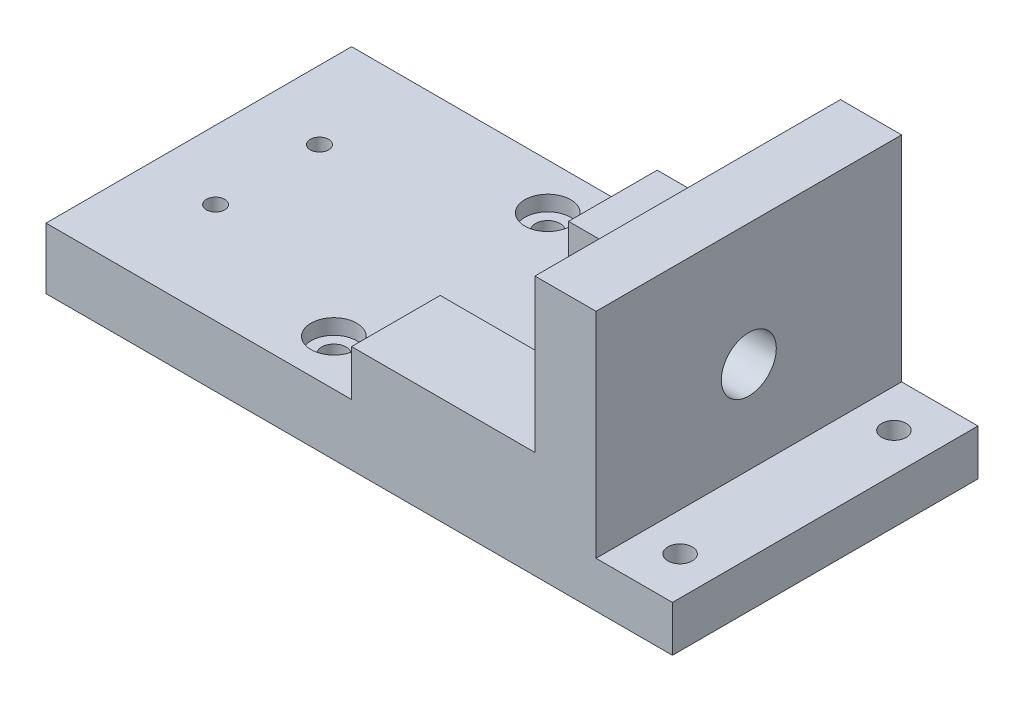
ISO-10303-21;
HEADER;
FILE_DESCRIPTION(('STEP AP214'),'2;1');
FILE_NAME('part.step','',(''),(''),'','','');
FILE_SCHEMA(('AUTOMOTIVE_DESIGN { 1 0 10303 214 1 1 1 1 }'));
ENDSEC;
DATA;
#1=APPLICATION_CONTEXT('core data for automotive mechanical design processes');
#2=APPLICATION_PROTOCOL_DEFINITION('international standard','automotive_design',2000,#1);
#3=PRODUCT_CONTEXT('',#1,'mechanical');
#4=PRODUCT('Part','Part','',(#3));
#5=PRODUCT_RELATED_PRODUCT_CATEGORY('part','',(#4));
#6=PRODUCT_DEFINITION_FORMATION('','',#4);
#7=PRODUCT_DEFINITION_CONTEXT('part definition',#1,'design');
#8=PRODUCT_DEFINITION('design','',#6,#7);
#9=PRODUCT_DEFINITION_SHAPE('','',#8);
#10=(LENGTH_UNIT() NAMED_UNIT(*) SI_UNIT(.MILLI.,.METRE.));
#11=(NAMED_UNIT(*) PLANE_ANGLE_UNIT() SI_UNIT($,.RADIAN.));
#12=(NAMED_UNIT(*) SI_UNIT($,.STERADIAN.) SOLID_ANGLE_UNIT());
#13=UNCERTAINTY_MEASURE_WITH_UNIT(LENGTH_MEASURE(1.E-05),#10,'distance_accuracy_value','');
#14=(GEOMETRIC_REPRESENTATION_CONTEXT(3) GLOBAL_UNCERTAINTY_ASSIGNED_CONTEXT((#13)) GLOBAL_UNIT_ASSIGNED_CONTEXT((#10,
#11,#12)) REPRESENTATION_CONTEXT('',''));
#15=CARTESIAN_POINT('',(0.,0.,0.));
#16=DIRECTION('',(0.,0.,1.));
#17=DIRECTION('',(1.,0.,0.));
#18=AXIS2_PLACEMENT_3D('',#15,#16,#17);
#19=CARTESIAN_POINT('',(-105.,20.,50.));
#20=DIRECTION('',(0.,-1.,0.));
#21=DIRECTION('',(1.,0.,0.));
#22=AXIS2_PLACEMENT_3D('',#19,#20,#21);
#23=PLANE('',#22);
#24=DIRECTION('',(-1.,0.,0.));
#25=VECTOR('',#24,1.);
#26=CARTESIAN_POINT('',(-105.,20.,-50.));
#27=LINE('',#26,#25);
#28=CARTESIAN_POINT('',(-105.,20.,-50.));
#29=VERTEX_POINT('',#28);
#30=CARTESIAN_POINT('',(-205.,20.,-50.));
#31=VERTEX_POINT('',#30);
#32=EDGE_CURVE('E181',#29,#31,#27,.T.);
#33=ORIENTED_EDGE('',*,*,#32,.T.);
#34=DIRECTION('',(0.,0.,-1.));
#35=VECTOR('',#34,1.);
#36=CARTESIAN_POINT('',(-205.,20.,50.));
#37=LINE('',#36,#35);
#38=CARTESIAN_POINT('',(-205.,20.,50.));
#39=VERTEX_POINT('',#38);
#40=EDGE_CURVE('E154',#39,#31,#37,.T.);
#41=ORIENTED_EDGE('',*,*,#40,.F.);
#42=DIRECTION('',(-1.,0.,0.));
#43=VECTOR('',#42,1.);
#44=CARTESIAN_POINT('',(-105.,20.,50.));
#45=LINE('',#44,#43);
#46=CARTESIAN_POINT('',(-105.,20.,50.));
#47=VERTEX_POINT('',#46);
#48=EDGE_CURVE('E135',#47,#39,#45,.T.);
#49=ORIENTED_EDGE('',*,*,#48,.F.);
#50=DIRECTION('',(0.,0.,-1.));
#51=VECTOR('',#50,1.);
#52=CARTESIAN_POINT('',(-105.,20.,50.));
#53=LINE('',#52,#51);
#54=CARTESIAN_POINT('',(-105.,20.,21.));
#55=VERTEX_POINT('',#54);
#56=EDGE_CURVE('E145',#47,#55,#53,.T.);
#57=ORIENTED_EDGE('',*,*,#56,.T.);
#58=DIRECTION('',(1.,0.,0.));
#59=VECTOR('',#58,1.);
#60=CARTESIAN_POINT('',(-105.,20.,21.));
#61=LINE('',#60,#59);
#62=CARTESIAN_POINT('',(-45.,20.,21.));
#63=VERTEX_POINT('',#62);
#64=EDGE_CURVE('E260',#55,#63,#61,.T.);
#65=ORIENTED_EDGE('',*,*,#64,.T.);
#66=DIRECTION('',(0.,0.,-1.));
#67=VECTOR('',#66,1.);
#68=CARTESIAN_POINT('',(-45.,20.,-21.));
#69=LINE('',#68,#67);
#70=CARTESIAN_POINT('',(-45.,20.,-21.));
#71=VERTEX_POINT('',#70);
#72=EDGE_CURVE('E268',#63,#71,#69,.T.);
#73=ORIENTED_EDGE('',*,*,#72,.T.);
#74=DIRECTION('',(-1.,0.,0.));
#75=VECTOR('',#74,1.);
#76=CARTESIAN_POINT('',(-105.,20.,-21.));
#77=LINE('',#76,#75);
#78=CARTESIAN_POINT('',(-105.,20.,-21.));
#79=VERTEX_POINT('',#78);
#80=EDGE_CURVE('E54',#71,#79,#77,.T.);
#81=ORIENTED_EDGE('',*,*,#80,.T.);
#82=EDGE_CURVE('E151',#79,#29,#53,.T.);
#83=ORIENTED_EDGE('',*,*,#82,.T.);
#84=EDGE_LOOP('',(#33,#41,#49,#57,#65,#73,#81,#83));
#85=FACE_BOUND('',#84,.T.);
#86=CARTESIAN_POINT('',(-182.5,20.,17.));
#87=DIRECTION('',(0.,-1.,0.));
#88=DIRECTION('',(1.,0.,0.));
#89=AXIS2_PLACEMENT_3D('',#86,#87,#88);
#90=CIRCLE('',#89,2.99999999999999);
#91=CARTESIAN_POINT('',(-179.5,20.,17.));
#92=VERTEX_POINT('',#91);
#93=EDGE_CURVE('E235',#92,#92,#90,.T.);
#94=ORIENTED_EDGE('',*,*,#93,.T.);
#95=EDGE_LOOP('',(#94));
#96=FACE_BOUND('',#95,.T.);
#97=CARTESIAN_POINT('',(-182.5,20.,-17.));
#98=DIRECTION('',(0.,1.,0.));
#99=DIRECTION('',(-1.,0.,0.));
#100=AXIS2_PLACEMENT_3D('',#97,#98,#99);
#101=CIRCLE('',#100,2.99999999999999);
#102=CARTESIAN_POINT('',(-185.5,20.,-17.));
#103=VERTEX_POINT('',#102);
#104=EDGE_CURVE('E244',#103,#103,#101,.T.);
#105=ORIENTED_EDGE('',*,*,#104,.F.);
#106=EDGE_LOOP('',(#105));
#107=FACE_BOUND('',#106,.T.);
#108=CARTESIAN_POINT('',(-125.788008322754,20.,35.));
#109=DIRECTION('',(0.,-1.,0.));
#110=DIRECTION('',(1.,0.,0.));
#111=AXIS2_PLACEMENT_3D('',#108,#109,#110);
#112=CIRCLE('',#111,7.49999999999996);
#113=CARTESIAN_POINT('',(-118.288008322754,20.,35.));
#114=VERTEX_POINT('',#113);
#115=EDGE_CURVE('E227',#114,#114,#112,.T.);
#116=ORIENTED_EDGE('',*,*,#115,.T.);
#117=EDGE_LOOP('',(#116));
#118=FACE_BOUND('',#117,.T.);
#119=CARTESIAN_POINT('',(-125.788008322754,20.,-35.));
#120=DIRECTION('',(0.,1.,0.));
#121=DIRECTION('',(-1.,0.,0.));
#122=AXIS2_PLACEMENT_3D('',#119,#120,#121);
#123=CIRCLE('',#122,7.50000000000001);
#124=CARTESIAN_POINT('',(-133.288008322754,20.,-35.));
#125=VERTEX_POINT('',#124);
#126=EDGE_CURVE('E222',#125,#125,#123,.T.);
#127=ORIENTED_EDGE('',*,*,#126,.F.);
#128=EDGE_LOOP('',(#127));
#129=FACE_BOUND('',#128,.T.);
#130=ADVANCED_FACE('F37',(#85,#96,#107,#118,#129),#23,.F.);
#131=CARTESIAN_POINT('',(-125.788008322754,0.,-35.));
#132=DIRECTION('',(0.,1.,0.));
#133=DIRECTION('',(-1.,0.,0.));
#134=AXIS2_PLACEMENT_3D('',#131,#132,#133);
#135=CYLINDRICAL_SURFACE('',#134,3.99999999999999);
#136=CARTESIAN_POINT('',(-125.788008322754,0.,-35.));
#137=DIRECTION('',(0.,1.,0.));
#138=DIRECTION('',(-1.,0.,0.));
#139=AXIS2_PLACEMENT_3D('',#136,#137,#138);
#140=CIRCLE('',#139,3.99999999999999);
#141=CARTESIAN_POINT('',(-129.788008322754,0.,-35.));
#142=VERTEX_POINT('',#141);
#143=EDGE_CURVE('E241',#142,#142,#140,.T.);
#144=ORIENTED_EDGE('',*,*,#143,.F.);
#145=EDGE_LOOP('',(#144));
#146=FACE_BOUND('',#145,.T.);
#147=CARTESIAN_POINT('',(-125.788008322754,15.,-35.));
#148=DIRECTION('',(0.,1.,0.));
#149=DIRECTION('',(-1.,0.,0.));
#150=AXIS2_PLACEMENT_3D('',#147,#148,#149);
#151=CIRCLE('',#150,3.99999999999999);
#152=CARTESIAN_POINT('',(-129.788008322754,15.,-35.));
#153=VERTEX_POINT('',#152);
#154=EDGE_CURVE('E214',#153,#153,#151,.F.);
#155=ORIENTED_EDGE('',*,*,#154,.F.);
#156=EDGE_LOOP('',(#155));
#157=FACE_BOUND('',#156,.T.);
#158=ADVANCED_FACE('F360',(#146,#157),#135,.F.);
#159=CARTESIAN_POINT('',(-205.,0.,50.));
#160=DIRECTION('',(0.,1.,0.));
#161=DIRECTION('',(0.,0.,1.));
#162=AXIS2_PLACEMENT_3D('',#159,#160,#161);
#163=PLANE('',#162);
#164=ORIENTED_EDGE('',*,*,#143,.T.);
#165=EDGE_LOOP('',(#164));
#166=FACE_BOUND('',#165,.T.);
#167=CARTESIAN_POINT('',(-182.5,0.,-17.));
#168=DIRECTION('',(0.,1.,0.));
#169=DIRECTION('',(-1.,0.,0.));
#170=AXIS2_PLACEMENT_3D('',#167,#168,#169);
#171=CIRCLE('',#170,2.99999999999999);
#172=CARTESIAN_POINT('',(-185.5,0.,-17.));
#173=VERTEX_POINT('',#172);
#174=EDGE_CURVE('E247',#173,#173,#171,.T.);
#175=ORIENTED_EDGE('',*,*,#174,.T.);
#176=EDGE_LOOP('',(#175));
#177=FACE_BOUND('',#176,.T.);
#178=CARTESIAN_POINT('',(-12.5,0.,-35.));
#179=DIRECTION('',(0.,1.,0.));
#180=DIRECTION('',(-1.,0.,0.));
#181=AXIS2_PLACEMENT_3D('',#178,#179,#180);
#182=CIRCLE('',#181,4.);
#183=CARTESIAN_POINT('',(-16.5,0.,-35.));
#184=VERTEX_POINT('',#183);
#185=EDGE_CURVE('E211',#184,#184,#182,.T.);
#186=ORIENTED_EDGE('',*,*,#185,.T.);
#187=EDGE_LOOP('',(#186));
#188=FACE_BOUND('',#187,.T.);
#189=DIRECTION('',(1.,0.,0.));
#190=VECTOR('',#189,1.);
#191=CARTESIAN_POINT('',(-205.,0.,-50.));
#192=LINE('',#191,#190);
#193=CARTESIAN_POINT('',(-205.,0.,-50.));
#194=VERTEX_POINT('',#193);
#195=CARTESIAN_POINT('',(0.,0.,-50.));
#196=VERTEX_POINT('',#195);
#197=EDGE_CURVE('E160',#194,#196,#192,.T.);
#198=ORIENTED_EDGE('',*,*,#197,.T.);
#199=DIRECTION('',(0.,0.,-1.));
#200=VECTOR('',#199,1.);
#201=CARTESIAN_POINT('',(0.,0.,50.));
#202=LINE('',#201,#200);
#203=CARTESIAN_POINT('',(0.,0.,50.));
#204=VERTEX_POINT('',#203);
#205=EDGE_CURVE('E11',#204,#196,#202,.T.);
#206=ORIENTED_EDGE('',*,*,#205,.F.);
#207=DIRECTION('',(1.,0.,0.));
#208=VECTOR('',#207,1.);
#209=CARTESIAN_POINT('',(-205.,0.,50.));
#210=LINE('',#209,#208);
#211=CARTESIAN_POINT('',(-205.,0.,50.));
#212=VERTEX_POINT('',#211);
#213=EDGE_CURVE('E184',#212,#204,#210,.T.);
#214=ORIENTED_EDGE('',*,*,#213,.F.);
#215=DIRECTION('',(0.,0.,-1.));
#216=VECTOR('',#215,1.);
#217=CARTESIAN_POINT('',(-205.,0.,50.));
#218=LINE('',#217,#216);
#219=EDGE_CURVE('E156',#212,#194,#218,.T.);
#220=ORIENTED_EDGE('',*,*,#219,.T.);
#221=EDGE_LOOP('',(#198,#206,#214,#220));
#222=FACE_BOUND('',#221,.T.);
#223=CARTESIAN_POINT('',(-182.5,0.,17.));
#224=DIRECTION('',(0.,-1.,0.));
#225=DIRECTION('',(1.,0.,0.));
#226=AXIS2_PLACEMENT_3D('',#223,#224,#225);
#227=CIRCLE('',#226,2.99999999999999);
#228=CARTESIAN_POINT('',(-179.5,0.,17.));
#229=VERTEX_POINT('',#228);
#230=EDGE_CURVE('E220',#229,#229,#227,.T.);
#231=ORIENTED_EDGE('',*,*,#230,.F.);
#232=EDGE_LOOP('',(#231));
#233=FACE_BOUND('',#232,.T.);
#234=CARTESIAN_POINT('',(-125.788008322754,0.,35.));
#235=DIRECTION('',(0.,-1.,0.));
#236=DIRECTION('',(1.,0.,0.));
#237=AXIS2_PLACEMENT_3D('',#234,#235,#236);
#238=CIRCLE('',#237,3.99999999999994);
#239=CARTESIAN_POINT('',(-121.788008322754,0.,35.));
#240=VERTEX_POINT('',#239);
#241=EDGE_CURVE('E238',#240,#240,#238,.T.);
#242=ORIENTED_EDGE('',*,*,#241,.F.);
#243=EDGE_LOOP('',(#242));
#244=FACE_BOUND('',#243,.T.);
#245=CARTESIAN_POINT('',(-12.5,0.,35.));
#246=DIRECTION('',(0.,-1.,0.));
#247=DIRECTION('',(1.,0.,0.));
#248=AXIS2_PLACEMENT_3D('',#245,#246,#247);
#249=CIRCLE('',#248,4.);
#250=CARTESIAN_POINT('',(-8.49999999999999,0.,35.));
#251=VERTEX_POINT('',#250);
#252=EDGE_CURVE('E250',#251,#251,#249,.T.);
#253=ORIENTED_EDGE('',*,*,#252,.F.);
#254=EDGE_LOOP('',(#253));
#255=FACE_BOUND('',#254,.T.);
#256=ADVANCED_FACE('F39',(#166,#177,#188,#222,#233,#244,#255),#163,.F.);
#257=CARTESIAN_POINT('',(0.,15.,50.));
#258=DIRECTION('',(0.,-1.,0.));
#259=DIRECTION('',(1.,0.,0.));
#260=AXIS2_PLACEMENT_3D('',#257,#258,#259);
#261=PLANE('',#260);
#262=CARTESIAN_POINT('',(-12.5,15.,-35.));
#263=DIRECTION('',(0.,-1.,0.));
#264=DIRECTION('',(1.,0.,0.));
#265=AXIS2_PLACEMENT_3D('',#262,#263,#264);
#266=CIRCLE('',#265,4.);
#267=CARTESIAN_POINT('',(-8.5,15.,-35.));
#268=VERTEX_POINT('',#267);
#269=EDGE_CURVE('E207',#268,#268,#266,.T.);
#270=ORIENTED_EDGE('',*,*,#269,.T.);
#271=EDGE_LOOP('',(#270));
#272=FACE_BOUND('',#271,.T.);
#273=DIRECTION('',(-1.,0.,0.));
#274=VECTOR('',#273,1.);
#275=CARTESIAN_POINT('',(0.,15.,-50.));
#276=LINE('',#275,#274);
#277=CARTESIAN_POINT('',(0.,15.,-50.));
#278=VERTEX_POINT('',#277);
#279=CARTESIAN_POINT('',(-25.,15.,-50.));
#280=VERTEX_POINT('',#279);
#281=EDGE_CURVE('E166',#278,#280,#276,.T.);
#282=ORIENTED_EDGE('',*,*,#281,.T.);
#283=DIRECTION('',(0.,0.,-1.));
#284=VECTOR('',#283,1.);
#285=CARTESIAN_POINT('',(-25.,15.,50.));
#286=LINE('',#285,#284);
#287=CARTESIAN_POINT('',(-25.,15.,50.));
#288=VERTEX_POINT('',#287);
#289=EDGE_CURVE('E199',#288,#280,#286,.T.);
#290=ORIENTED_EDGE('',*,*,#289,.F.);
#291=DIRECTION('',(-1.,0.,0.));
#292=VECTOR('',#291,1.);
#293=CARTESIAN_POINT('',(0.,15.,50.));
#294=LINE('',#293,#292);
#295=CARTESIAN_POINT('',(0.,15.,50.));
#296=VERTEX_POINT('',#295);
#297=EDGE_CURVE('E281',#296,#288,#294,.T.);
#298=ORIENTED_EDGE('',*,*,#297,.F.);
#299=DIRECTION('',(0.,0.,-1.));
#300=VECTOR('',#299,1.);
#301=CARTESIAN_POINT('',(0.,15.,50.));
#302=LINE('',#301,#300);
#303=EDGE_CURVE('E46',#296,#278,#302,.T.);
#304=ORIENTED_EDGE('',*,*,#303,.T.);
#305=EDGE_LOOP('',(#282,#290,#298,#304));
#306=FACE_BOUND('',#305,.T.);
#307=CARTESIAN_POINT('',(-12.5,15.,35.));
#308=DIRECTION('',(0.,-1.,0.));
#309=DIRECTION('',(1.,0.,0.));
#310=AXIS2_PLACEMENT_3D('',#307,#308,#309);
#311=CIRCLE('',#310,4.);
#312=CARTESIAN_POINT('',(-8.49999999999999,15.,35.));
#313=VERTEX_POINT('',#312);
#314=EDGE_CURVE('E210',#313,#313,#311,.F.);
#315=ORIENTED_EDGE('',*,*,#314,.F.);
#316=EDGE_LOOP('',(#315));
#317=FACE_BOUND('',#316,.T.);
#318=ADVANCED_FACE('F340',(#272,#306,#317),#261,.F.);
#319=CARTESIAN_POINT('',(-45.,35.,50.));
#320=DIRECTION('',(0.,-1.,0.));
#321=DIRECTION('',(0.,0.,-1.));
#322=AXIS2_PLACEMENT_3D('',#319,#320,#321);
#323=PLANE('',#322);
#324=DIRECTION('',(0.,0.,-1.));
#325=VECTOR('',#324,1.);
#326=CARTESIAN_POINT('',(-45.,35.,50.));
#327=LINE('',#326,#325);
#328=CARTESIAN_POINT('',(-45.,35.,50.));
#329=VERTEX_POINT('',#328);
#330=CARTESIAN_POINT('',(-45.,35.,21.));
#331=VERTEX_POINT('',#330);
#332=EDGE_CURVE('E190',#329,#331,#327,.T.);
#333=ORIENTED_EDGE('',*,*,#332,.T.);
#334=DIRECTION('',(1.,0.,0.));
#335=VECTOR('',#334,1.);
#336=CARTESIAN_POINT('',(-105.,35.,21.));
#337=LINE('',#336,#335);
#338=CARTESIAN_POINT('',(-105.,35.,21.));
#339=VERTEX_POINT('',#338);
#340=EDGE_CURVE('E213',#339,#331,#337,.T.);
#341=ORIENTED_EDGE('',*,*,#340,.F.);
#342=DIRECTION('',(0.,0.,-1.));
#343=VECTOR('',#342,1.);
#344=CARTESIAN_POINT('',(-105.,35.,50.));
#345=LINE('',#344,#343);
#346=CARTESIAN_POINT('',(-105.,35.,50.));
#347=VERTEX_POINT('',#346);
#348=EDGE_CURVE('E187',#347,#339,#345,.T.);
#349=ORIENTED_EDGE('',*,*,#348,.F.);
#350=DIRECTION('',(-1.,0.,0.));
#351=VECTOR('',#350,1.);
#352=CARTESIAN_POINT('',(-45.,35.,50.));
#353=LINE('',#352,#351);
#354=EDGE_CURVE('E138',#329,#347,#353,.T.);
#355=ORIENTED_EDGE('',*,*,#354,.F.);
#356=EDGE_LOOP('',(#333,#341,#349,#355));
#357=FACE_BOUND('',#356,.T.);
#358=ADVANCED_FACE('F299',(#357),#323,.F.);
#359=CARTESIAN_POINT('',(-105.,35.,50.));
#360=DIRECTION('',(1.,0.,0.));
#361=DIRECTION('',(0.,0.,-1.));
#362=AXIS2_PLACEMENT_3D('',#359,#360,#361);
#363=PLANE('',#362);
#364=ORIENTED_EDGE('',*,*,#348,.T.);
#365=DIRECTION('',(0.,1.,0.));
#366=VECTOR('',#365,1.);
#367=CARTESIAN_POINT('',(-105.,-53.2393336944022,21.));
#368=LINE('',#367,#366);
#369=EDGE_CURVE('E148',#55,#339,#368,.T.);
#370=ORIENTED_EDGE('',*,*,#369,.F.);
#371=ORIENTED_EDGE('',*,*,#56,.F.);
#372=DIRECTION('',(0.,-1.,0.));
#373=VECTOR('',#372,1.);
#374=CARTESIAN_POINT('',(-105.,35.,50.));
#375=LINE('',#374,#373);
#376=EDGE_CURVE('E131',#347,#47,#375,.T.);
#377=ORIENTED_EDGE('',*,*,#376,.F.);
#378=EDGE_LOOP('',(#364,#370,#371,#377));
#379=FACE_BOUND('',#378,.T.);
#380=ADVANCED_FACE('F146',(#379),#363,.F.);
#381=CARTESIAN_POINT('',(0.,0.,50.));
#382=DIRECTION('',(-1.,0.,0.));
#383=DIRECTION('',(0.,0.,1.));
#384=AXIS2_PLACEMENT_3D('',#381,#382,#383);
#385=PLANE('',#384);
#386=DIRECTION('',(0.,1.,0.));
#387=VECTOR('',#386,1.);
#388=CARTESIAN_POINT('',(0.,0.,-50.));
#389=LINE('',#388,#387);
#390=EDGE_CURVE('E163',#196,#278,#389,.T.);
#391=ORIENTED_EDGE('',*,*,#390,.T.);
#392=ORIENTED_EDGE('',*,*,#303,.F.);
#393=DIRECTION('',(0.,1.,0.));
#394=VECTOR('',#393,1.);
#395=CARTESIAN_POINT('',(0.,0.,50.));
#396=LINE('',#395,#394);
#397=EDGE_CURVE('E109',#204,#296,#396,.T.);
#398=ORIENTED_EDGE('',*,*,#397,.F.);
#399=ORIENTED_EDGE('',*,*,#205,.T.);
#400=EDGE_LOOP('',(#391,#392,#398,#399));
#401=FACE_BOUND('',#400,.T.);
#402=ADVANCED_FACE('F338',(#401),#385,.F.);
#403=CARTESIAN_POINT('',(-25.,15.,50.));
#404=DIRECTION('',(-1.,0.,0.));
#405=DIRECTION('',(0.,0.,1.));
#406=AXIS2_PLACEMENT_3D('',#403,#404,#405);
#407=PLANE('',#406);
#408=CARTESIAN_POINT('',(-25.,45.,0.));
#409=DIRECTION('',(1.,0.,0.));
#410=DIRECTION('',(0.,0.,-1.));
#411=AXIS2_PLACEMENT_3D('',#408,#409,#410);
#412=CIRCLE('',#411,9.);
#413=CARTESIAN_POINT('',(-25.,45.,-9.));
#414=VERTEX_POINT('',#413);
#415=EDGE_CURVE('E206',#414,#414,#412,.T.);
#416=ORIENTED_EDGE('',*,*,#415,.F.);
#417=EDGE_LOOP('',(#416));
#418=FACE_BOUND('',#417,.T.);
#419=DIRECTION('',(0.,1.,0.));
#420=VECTOR('',#419,1.);
#421=CARTESIAN_POINT('',(-25.,15.,-50.));
#422=LINE('',#421,#420);
#423=CARTESIAN_POINT('',(-25.,85.,-50.));
#424=VERTEX_POINT('',#423);
#425=EDGE_CURVE('E168',#280,#424,#422,.T.);
#426=ORIENTED_EDGE('',*,*,#425,.T.);
#427=DIRECTION('',(0.,0.,-1.));
#428=VECTOR('',#427,1.);
#429=CARTESIAN_POINT('',(-25.,85.,50.));
#430=LINE('',#429,#428);
#431=CARTESIAN_POINT('',(-25.,85.,50.));
#432=VERTEX_POINT('',#431);
#433=EDGE_CURVE('E196',#432,#424,#430,.T.);
#434=ORIENTED_EDGE('',*,*,#433,.F.);
#435=DIRECTION('',(0.,1.,0.));
#436=VECTOR('',#435,1.);
#437=CARTESIAN_POINT('',(-25.,15.,50.));
#438=LINE('',#437,#436);
#439=EDGE_CURVE('E283',#288,#432,#438,.T.);
#440=ORIENTED_EDGE('',*,*,#439,.F.);
#441=ORIENTED_EDGE('',*,*,#289,.T.);
#442=EDGE_LOOP('',(#426,#434,#440,#441));
#443=FACE_BOUND('',#442,.T.);
#444=ADVANCED_FACE('F346',(#418,#443),#407,.F.);
#445=CARTESIAN_POINT('',(-25.,85.,50.));
#446=DIRECTION('',(0.,-1.,0.));
#447=DIRECTION('',(1.,0.,0.));
#448=AXIS2_PLACEMENT_3D('',#445,#446,#447);
#449=PLANE('',#448);
#450=DIRECTION('',(-1.,0.,0.));
#451=VECTOR('',#450,1.);
#452=CARTESIAN_POINT('',(-25.,85.,-50.));
#453=LINE('',#452,#451);
#454=CARTESIAN_POINT('',(-45.,85.,-50.));
#455=VERTEX_POINT('',#454);
#456=EDGE_CURVE('E170',#424,#455,#453,.T.);
#457=ORIENTED_EDGE('',*,*,#456,.T.);
#458=DIRECTION('',(0.,0.,-1.));
#459=VECTOR('',#458,1.);
#460=CARTESIAN_POINT('',(-45.,85.,50.));
#461=LINE('',#460,#459);
#462=CARTESIAN_POINT('',(-45.,85.,50.));
#463=VERTEX_POINT('',#462);
#464=EDGE_CURVE('E193',#463,#455,#461,.T.);
#465=ORIENTED_EDGE('',*,*,#464,.F.);
#466=DIRECTION('',(-1.,0.,0.));
#467=VECTOR('',#466,1.);
#468=CARTESIAN_POINT('',(-25.,85.,50.));
#469=LINE('',#468,#467);
#470=EDGE_CURVE('E285',#432,#463,#469,.T.);
#471=ORIENTED_EDGE('',*,*,#470,.F.);
#472=ORIENTED_EDGE('',*,*,#433,.T.);
#473=EDGE_LOOP('',(#457,#465,#471,#472));
#474=FACE_BOUND('',#473,.T.);
#475=ADVANCED_FACE('F348',(#474),#449,.F.);
#476=CARTESIAN_POINT('',(-45.,85.,50.));
#477=DIRECTION('',(1.,0.,0.));
#478=DIRECTION('',(0.,1.,0.));
#479=AXIS2_PLACEMENT_3D('',#476,#477,#478);
#480=PLANE('',#479);
#481=CARTESIAN_POINT('',(-45.,45.,0.));
#482=DIRECTION('',(1.,0.,0.));
#483=DIRECTION('',(0.,1.,0.));
#484=AXIS2_PLACEMENT_3D('',#481,#482,#483);
#485=CIRCLE('',#484,9.);
#486=CARTESIAN_POINT('',(-45.,45.,-9.));
#487=VERTEX_POINT('',#486);
#488=EDGE_CURVE('E164',#487,#487,#485,.T.);
#489=ORIENTED_EDGE('',*,*,#488,.T.);
#490=EDGE_LOOP('',(#489));
#491=FACE_BOUND('',#490,.T.);
#492=DIRECTION('',(0.,-1.,0.));
#493=VECTOR('',#492,1.);
#494=CARTESIAN_POINT('',(-45.,85.,-50.));
#495=LINE('',#494,#493);
#496=CARTESIAN_POINT('',(-45.,35.,-50.));
#497=VERTEX_POINT('',#496);
#498=EDGE_CURVE('E172',#455,#497,#495,.T.);
#499=ORIENTED_EDGE('',*,*,#498,.T.);
#500=CARTESIAN_POINT('',(-45.,35.,-21.));
#501=VERTEX_POINT('',#500);
#502=EDGE_CURVE('E189',#501,#497,#327,.T.);
#503=ORIENTED_EDGE('',*,*,#502,.F.);
#504=DIRECTION('',(0.,1.,0.));
#505=VECTOR('',#504,1.);
#506=CARTESIAN_POINT('',(-45.,-53.2393336944022,-21.));
#507=LINE('',#506,#505);
#508=EDGE_CURVE('E267',#71,#501,#507,.T.);
#509=ORIENTED_EDGE('',*,*,#508,.F.);
#510=ORIENTED_EDGE('',*,*,#72,.F.);
#511=DIRECTION('',(0.,1.,0.));
#512=VECTOR('',#511,1.);
#513=CARTESIAN_POINT('',(-45.,-53.2393336944022,21.));
#514=LINE('',#513,#512);
#515=EDGE_CURVE('E264',#63,#331,#514,.T.);
#516=ORIENTED_EDGE('',*,*,#515,.T.);
#517=ORIENTED_EDGE('',*,*,#332,.F.);
#518=DIRECTION('',(0.,-1.,0.));
#519=VECTOR('',#518,1.);
#520=CARTESIAN_POINT('',(-45.,85.,50.));
#521=LINE('',#520,#519);
#522=EDGE_CURVE('E287',#463,#329,#521,.T.);
#523=ORIENTED_EDGE('',*,*,#522,.F.);
#524=ORIENTED_EDGE('',*,*,#464,.T.);
#525=EDGE_LOOP('',(#499,#503,#509,#510,#516,#517,#523,#524));
#526=FACE_BOUND('',#525,.T.);
#527=ADVANCED_FACE('F293',(#491,#526),#480,.F.);
#528=CARTESIAN_POINT('',(-105.,35.,-21.));
#529=VERTEX_POINT('',#528);
#530=CARTESIAN_POINT('',(-105.,35.,-50.));
#531=VERTEX_POINT('',#530);
#532=EDGE_CURVE('E150',#529,#531,#345,.T.);
#533=ORIENTED_EDGE('',*,*,#532,.F.);
#534=DIRECTION('',(-1.,0.,0.));
#535=VECTOR('',#534,1.);
#536=CARTESIAN_POINT('',(-105.,35.,-21.));
#537=LINE('',#536,#535);
#538=EDGE_CURVE('E257',#501,#529,#537,.T.);
#539=ORIENTED_EDGE('',*,*,#538,.F.);
#540=ORIENTED_EDGE('',*,*,#502,.T.);
#541=DIRECTION('',(-1.,0.,0.));
#542=VECTOR('',#541,1.);
#543=CARTESIAN_POINT('',(-45.,35.,-50.));
#544=LINE('',#543,#542);
#545=EDGE_CURVE('E175',#497,#531,#544,.T.);
#546=ORIENTED_EDGE('',*,*,#545,.T.);
#547=EDGE_LOOP('',(#533,#539,#540,#546));
#548=FACE_BOUND('',#547,.T.);
#549=ADVANCED_FACE('F318',(#548),#323,.F.);
#550=ORIENTED_EDGE('',*,*,#82,.F.);
#551=DIRECTION('',(0.,1.,0.));
#552=VECTOR('',#551,1.);
#553=CARTESIAN_POINT('',(-105.,-53.2393336944022,-21.));
#554=LINE('',#553,#552);
#555=EDGE_CURVE('E266',#79,#529,#554,.T.);
#556=ORIENTED_EDGE('',*,*,#555,.T.);
#557=ORIENTED_EDGE('',*,*,#532,.T.);
#558=DIRECTION('',(0.,-1.,0.));
#559=VECTOR('',#558,1.);
#560=CARTESIAN_POINT('',(-105.,35.,-50.));
#561=LINE('',#560,#559);
#562=EDGE_CURVE('E178',#531,#29,#561,.T.);
#563=ORIENTED_EDGE('',*,*,#562,.T.);
#564=EDGE_LOOP('',(#550,#556,#557,#563));
#565=FACE_BOUND('',#564,.T.);
#566=ADVANCED_FACE('F329',(#565),#363,.F.);
#567=CARTESIAN_POINT('',(-205.,20.,50.));
#568=DIRECTION('',(1.,0.,0.));
#569=DIRECTION('',(0.,0.,-1.));
#570=AXIS2_PLACEMENT_3D('',#567,#568,#569);
#571=PLANE('',#570);
#572=DIRECTION('',(0.,-1.,0.));
#573=VECTOR('',#572,1.);
#574=CARTESIAN_POINT('',(-205.,20.,-50.));
#575=LINE('',#574,#573);
#576=EDGE_CURVE('E101',#31,#194,#575,.T.);
#577=ORIENTED_EDGE('',*,*,#576,.T.);
#578=ORIENTED_EDGE('',*,*,#219,.F.);
#579=DIRECTION('',(0.,-1.,0.));
#580=VECTOR('',#579,1.);
#581=CARTESIAN_POINT('',(-205.,20.,50.));
#582=LINE('',#581,#580);
#583=EDGE_CURVE('E63',#39,#212,#582,.T.);
#584=ORIENTED_EDGE('',*,*,#583,.F.);
#585=ORIENTED_EDGE('',*,*,#40,.T.);
#586=EDGE_LOOP('',(#577,#578,#584,#585));
#587=FACE_BOUND('',#586,.T.);
#588=ADVANCED_FACE('F330',(#587),#571,.F.);
#589=CARTESIAN_POINT('',(0.,0.,50.));
#590=DIRECTION('',(0.,0.,1.));
#591=DIRECTION('',(1.,0.,0.));
#592=AXIS2_PLACEMENT_3D('',#589,#590,#591);
#593=PLANE('',#592);
#594=ORIENTED_EDGE('',*,*,#213,.T.);
#595=ORIENTED_EDGE('',*,*,#397,.T.);
#596=ORIENTED_EDGE('',*,*,#297,.T.);
#597=ORIENTED_EDGE('',*,*,#439,.T.);
#598=ORIENTED_EDGE('',*,*,#470,.T.);
#599=ORIENTED_EDGE('',*,*,#522,.T.);
#600=ORIENTED_EDGE('',*,*,#354,.T.);
#601=ORIENTED_EDGE('',*,*,#376,.T.);
#602=ORIENTED_EDGE('',*,*,#48,.T.);
#603=ORIENTED_EDGE('',*,*,#583,.T.);
#604=EDGE_LOOP('',(#594,#595,#596,#597,#598,#599,#600,#601,#602,#603));
#605=FACE_BOUND('',#604,.T.);
#606=ADVANCED_FACE('F133',(#605),#593,.T.);
#607=CARTESIAN_POINT('',(0.,0.,-50.));
#608=DIRECTION('',(0.,0.,1.));
#609=DIRECTION('',(1.,0.,0.));
#610=AXIS2_PLACEMENT_3D('',#607,#608,#609);
#611=PLANE('',#610);
#612=ORIENTED_EDGE('',*,*,#197,.F.);
#613=ORIENTED_EDGE('',*,*,#576,.F.);
#614=ORIENTED_EDGE('',*,*,#32,.F.);
#615=ORIENTED_EDGE('',*,*,#562,.F.);
#616=ORIENTED_EDGE('',*,*,#545,.F.);
#617=ORIENTED_EDGE('',*,*,#498,.F.);
#618=ORIENTED_EDGE('',*,*,#456,.F.);
#619=ORIENTED_EDGE('',*,*,#425,.F.);
#620=ORIENTED_EDGE('',*,*,#281,.F.);
#621=ORIENTED_EDGE('',*,*,#390,.F.);
#622=EDGE_LOOP('',(#612,#613,#614,#615,#616,#617,#618,#619,#620,#621));
#623=FACE_BOUND('',#622,.T.);
#624=ADVANCED_FACE('F325',(#623),#611,.F.);
#625=CARTESIAN_POINT('',(-205.,45.,0.));
#626=DIRECTION('',(1.,0.,0.));
#627=DIRECTION('',(0.,0.,-1.));
#628=AXIS2_PLACEMENT_3D('',#625,#626,#627);
#629=CYLINDRICAL_SURFACE('',#628,9.);
#630=CARTESIAN_POINT('',(-25.,45.,-9.));
#631=CARTESIAN_POINT('',(-25.2083333333333,45.,-9.));
#632=CARTESIAN_POINT('',(-25.4166666666667,45.,-9.));
#633=CARTESIAN_POINT('',(-25.8333333333333,45.,-9.));
#634=CARTESIAN_POINT('',(-26.0416666666667,45.,-9.));
#635=CARTESIAN_POINT('',(-26.4583333333334,45.,-9.));
#636=CARTESIAN_POINT('',(-26.6666666666667,45.,-9.));
#637=CARTESIAN_POINT('',(-27.0833333333334,45.,-9.));
#638=CARTESIAN_POINT('',(-27.2916666666667,45.,-9.));
#639=CARTESIAN_POINT('',(-27.7083333333334,45.,-9.));
#640=CARTESIAN_POINT('',(-27.9166666666667,45.,-9.));
#641=CARTESIAN_POINT('',(-28.3333333333333,45.,-9.));
#642=CARTESIAN_POINT('',(-28.5416666666667,45.,-9.));
#643=CARTESIAN_POINT('',(-28.9583333333334,45.,-9.));
#644=CARTESIAN_POINT('',(-29.1666666666667,45.,-9.));
#645=CARTESIAN_POINT('',(-29.5833333333334,45.,-9.));
#646=CARTESIAN_POINT('',(-29.7916666666667,45.,-9.));
#647=CARTESIAN_POINT('',(-30.2083333333334,45.,-9.));
#648=CARTESIAN_POINT('',(-30.4166666666667,45.,-9.));
#649=CARTESIAN_POINT('',(-30.8333333333333,45.,-9.));
#650=CARTESIAN_POINT('',(-31.0416666666667,45.,-9.));
#651=CARTESIAN_POINT('',(-31.4583333333334,45.,-9.));
#652=CARTESIAN_POINT('',(-31.6666666666667,45.,-9.));
#653=CARTESIAN_POINT('',(-32.0833333333334,45.,-9.));
#654=CARTESIAN_POINT('',(-32.2916666666667,45.,-9.));
#655=CARTESIAN_POINT('',(-32.7083333333334,45.,-9.));
#656=CARTESIAN_POINT('',(-32.9166666666667,45.,-9.));
#657=CARTESIAN_POINT('',(-33.3333333333334,45.,-9.));
#658=CARTESIAN_POINT('',(-33.5416666666667,45.,-9.));
#659=CARTESIAN_POINT('',(-33.9583333333334,45.,-9.));
#660=CARTESIAN_POINT('',(-34.1666666666667,45.,-9.));
#661=CARTESIAN_POINT('',(-34.5833333333334,45.,-9.));
#662=CARTESIAN_POINT('',(-34.7916666666667,45.,-9.));
#663=CARTESIAN_POINT('',(-35.2083333333334,45.,-9.));
#664=CARTESIAN_POINT('',(-35.4166666666667,45.,-9.));
#665=CARTESIAN_POINT('',(-35.8333333333334,45.,-9.));
#666=CARTESIAN_POINT('',(-36.0416666666667,45.,-9.));
#667=CARTESIAN_POINT('',(-36.4583333333334,45.,-9.));
#668=CARTESIAN_POINT('',(-36.6666666666667,45.,-9.));
#669=CARTESIAN_POINT('',(-37.0833333333334,45.,-9.));
#670=CARTESIAN_POINT('',(-37.2916666666667,45.,-9.));
#671=CARTESIAN_POINT('',(-37.7083333333334,45.,-9.));
#672=CARTESIAN_POINT('',(-37.9166666666667,45.,-9.));
#673=CARTESIAN_POINT('',(-38.3333333333334,45.,-9.));
#674=CARTESIAN_POINT('',(-38.5416666666667,45.,-9.));
#675=CARTESIAN_POINT('',(-38.9583333333334,45.,-9.));
#676=CARTESIAN_POINT('',(-39.1666666666667,45.,-9.));
#677=CARTESIAN_POINT('',(-39.5833333333334,45.,-9.));
#678=CARTESIAN_POINT('',(-39.7916666666667,45.,-9.));
#679=CARTESIAN_POINT('',(-40.2083333333334,45.,-9.));
#680=CARTESIAN_POINT('',(-40.4166666666667,45.,-9.));
#681=CARTESIAN_POINT('',(-40.8333333333334,45.,-9.));
#682=CARTESIAN_POINT('',(-41.0416666666667,45.,-9.));
#683=CARTESIAN_POINT('',(-41.4583333333334,45.,-9.));
#684=CARTESIAN_POINT('',(-41.6666666666667,45.,-9.));
#685=CARTESIAN_POINT('',(-42.0833333333334,45.,-9.));
#686=CARTESIAN_POINT('',(-42.2916666666667,45.,-9.));
#687=CARTESIAN_POINT('',(-42.7083333333334,45.,-9.));
#688=CARTESIAN_POINT('',(-42.9166666666667,45.,-9.));
#689=CARTESIAN_POINT('',(-43.3333333333334,45.,-9.));
#690=CARTESIAN_POINT('',(-43.5416666666667,45.,-9.));
#691=CARTESIAN_POINT('',(-43.9583333333334,45.,-9.));
#692=CARTESIAN_POINT('',(-44.1666666666667,45.,-9.));
#693=CARTESIAN_POINT('',(-44.5833333333334,45.,-9.));
#694=CARTESIAN_POINT('',(-44.7916666666667,45.,-9.));
#695=CARTESIAN_POINT('',(-45.,45.,-9.));
#696=B_SPLINE_CURVE_WITH_KNOTS('',3,(#630,#631,#632,#633,#634,#635,#636,#637,#638,#639,#640,
#641,#642,#643,#644,#645,#646,#647,#648,#649,#650,#651,#652,#653,#654,#655,#656,#657,#658,#659,
#660,#661,#662,#663,#664,#665,#666,#667,#668,#669,#670,#671,#672,#673,#674,#675,#676,#677,#678,
#679,#680,#681,#682,#683,#684,#685,#686,#687,#688,#689,#690,#691,#692,#693,#694,#695),
.UNSPECIFIED.,.F.,.F.,(4,2,2,2,2,2,2,2,2,2,2,2,2,2,2,2,2,2,2,2,2,2,2,2,2,2,2,2,2,2,2,2,4),(0.,
0.624999999999987,1.25,1.87500000000002,2.5,3.12499999999999,3.75,4.37500000000002,5.,
5.62499999999999,6.25000000000001,6.87500000000002,7.50000000000001,8.12499999999999,
8.75000000000001,9.37500000000002,10.,10.625,11.25,11.875,12.5,13.125,13.75,14.375,15.,15.625,
16.25,16.875,17.5,18.125,18.75,19.375,20.),.UNSPECIFIED.);
#697=EDGE_CURVE('BSEAM407',#414,#487,#696,.T.);
#698=ORIENTED_EDGE('',*,*,#415,.T.);
#699=ORIENTED_EDGE('',*,*,#488,.F.);
#700=ORIENTED_EDGE('',*,*,#697,.T.);
#701=ORIENTED_EDGE('',*,*,#697,.F.);
#702=EDGE_LOOP('',(#698,#700,#699,#701));
#703=FACE_BOUND('',#702,.T.);
#704=ADVANCED_FACE('F407',(#703),#629,.F.);
#705=CARTESIAN_POINT('',(-105.,-53.2393336944022,21.));
#706=DIRECTION('',(0.,0.,1.));
#707=DIRECTION('',(1.,0.,0.));
#708=AXIS2_PLACEMENT_3D('',#705,#706,#707);
#709=PLANE('',#708);
#710=ORIENTED_EDGE('',*,*,#369,.T.);
#711=ORIENTED_EDGE('',*,*,#340,.T.);
#712=ORIENTED_EDGE('',*,*,#515,.F.);
#713=ORIENTED_EDGE('',*,*,#64,.F.);
#714=EDGE_LOOP('',(#710,#711,#712,#713));
#715=FACE_BOUND('',#714,.T.);
#716=ADVANCED_FACE('F411',(#715),#709,.F.);
#717=CARTESIAN_POINT('',(-105.,-53.2393336944022,-21.));
#718=DIRECTION('',(0.,0.,-1.));
#719=DIRECTION('',(-1.,0.,0.));
#720=AXIS2_PLACEMENT_3D('',#717,#718,#719);
#721=PLANE('',#720);
#722=ORIENTED_EDGE('',*,*,#508,.T.);
#723=ORIENTED_EDGE('',*,*,#538,.T.);
#724=ORIENTED_EDGE('',*,*,#555,.F.);
#725=ORIENTED_EDGE('',*,*,#80,.F.);
#726=EDGE_LOOP('',(#722,#723,#724,#725));
#727=FACE_BOUND('',#726,.T.);
#728=ADVANCED_FACE('F314',(#727),#721,.F.);
#729=CARTESIAN_POINT('',(-182.5,0.,17.));
#730=DIRECTION('',(0.,1.,0.));
#731=DIRECTION('',(-1.,0.,0.));
#732=AXIS2_PLACEMENT_3D('',#729,#730,#731);
#733=CYLINDRICAL_SURFACE('',#732,2.99999999999999);
#734=ORIENTED_EDGE('',*,*,#230,.T.);
#735=EDGE_LOOP('',(#734));
#736=FACE_BOUND('',#735,.T.);
#737=ORIENTED_EDGE('',*,*,#93,.F.);
#738=EDGE_LOOP('',(#737));
#739=FACE_BOUND('',#738,.T.);
#740=ADVANCED_FACE('F457',(#736,#739),#733,.F.);
#741=CARTESIAN_POINT('',(-125.788008322754,0.,35.));
#742=DIRECTION('',(0.,1.,0.));
#743=DIRECTION('',(-1.,0.,0.));
#744=AXIS2_PLACEMENT_3D('',#741,#742,#743);
#745=CYLINDRICAL_SURFACE('',#744,3.99999999999994);
#746=CARTESIAN_POINT('',(-125.788008322754,15.,35.));
#747=DIRECTION('',(0.,-1.,0.));
#748=DIRECTION('',(1.,0.,0.));
#749=AXIS2_PLACEMENT_3D('',#746,#747,#748);
#750=CIRCLE('',#749,3.99999999999994);
#751=CARTESIAN_POINT('',(-121.788008322754,15.,35.));
#752=VERTEX_POINT('',#751);
#753=EDGE_CURVE('E41',#752,#752,#750,.T.);
#754=ORIENTED_EDGE('',*,*,#753,.F.);
#755=EDGE_LOOP('',(#754));
#756=FACE_BOUND('',#755,.T.);
#757=ORIENTED_EDGE('',*,*,#241,.T.);
#758=EDGE_LOOP('',(#757));
#759=FACE_BOUND('',#758,.T.);
#760=ADVANCED_FACE('F476',(#756,#759),#745,.F.);
#761=CARTESIAN_POINT('',(-182.5,0.,-17.));
#762=DIRECTION('',(0.,1.,0.));
#763=DIRECTION('',(-1.,0.,0.));
#764=AXIS2_PLACEMENT_3D('',#761,#762,#763);
#765=CYLINDRICAL_SURFACE('',#764,2.99999999999999);
#766=ORIENTED_EDGE('',*,*,#174,.F.);
#767=EDGE_LOOP('',(#766));
#768=FACE_BOUND('',#767,.T.);
#769=ORIENTED_EDGE('',*,*,#104,.T.);
#770=EDGE_LOOP('',(#769));
#771=FACE_BOUND('',#770,.T.);
#772=ADVANCED_FACE('F484',(#768,#771),#765,.F.);
#773=CARTESIAN_POINT('',(-12.5,0.,-35.));
#774=DIRECTION('',(0.,1.,0.));
#775=DIRECTION('',(-1.,0.,0.));
#776=AXIS2_PLACEMENT_3D('',#773,#774,#775);
#777=CYLINDRICAL_SURFACE('',#776,4.);
#778=ORIENTED_EDGE('',*,*,#185,.F.);
#779=EDGE_LOOP('',(#778));
#780=FACE_BOUND('',#779,.T.);
#781=ORIENTED_EDGE('',*,*,#269,.F.);
#782=EDGE_LOOP('',(#781));
#783=FACE_BOUND('',#782,.T.);
#784=ADVANCED_FACE('F489',(#780,#783),#777,.F.);
#785=CARTESIAN_POINT('',(-12.5,0.,35.));
#786=DIRECTION('',(0.,1.,0.));
#787=DIRECTION('',(-1.,0.,0.));
#788=AXIS2_PLACEMENT_3D('',#785,#786,#787);
#789=CYLINDRICAL_SURFACE('',#788,4.);
#790=ORIENTED_EDGE('',*,*,#252,.T.);
#791=EDGE_LOOP('',(#790));
#792=FACE_BOUND('',#791,.T.);
#793=ORIENTED_EDGE('',*,*,#314,.T.);
#794=EDGE_LOOP('',(#793));
#795=FACE_BOUND('',#794,.T.);
#796=ADVANCED_FACE('F498',(#792,#795),#789,.F.);
#797=CARTESIAN_POINT('',(-125.788008322754,15.,-35.));
#798=DIRECTION('',(0.,1.,0.));
#799=DIRECTION('',(-1.,0.,0.));
#800=AXIS2_PLACEMENT_3D('',#797,#798,#799);
#801=PLANE('',#800);
#802=CARTESIAN_POINT('',(-125.788008322754,15.,-35.));
#803=DIRECTION('',(0.,1.,0.));
#804=DIRECTION('',(-1.,0.,0.));
#805=AXIS2_PLACEMENT_3D('',#802,#803,#804);
#806=CIRCLE('',#805,7.50000000000001);
#807=CARTESIAN_POINT('',(-133.288008322754,15.,-35.));
#808=VERTEX_POINT('',#807);
#809=EDGE_CURVE('E216',#808,#808,#806,.T.);
#810=ORIENTED_EDGE('',*,*,#809,.T.);
#811=EDGE_LOOP('',(#810));
#812=FACE_BOUND('',#811,.T.);
#813=ORIENTED_EDGE('',*,*,#154,.T.);
#814=EDGE_LOOP('',(#813));
#815=FACE_BOUND('',#814,.T.);
#816=ADVANCED_FACE('F507',(#812,#815),#801,.T.);
#817=CARTESIAN_POINT('',(-125.788008322754,15.,-35.));
#818=DIRECTION('',(0.,1.,0.));
#819=DIRECTION('',(-1.,0.,0.));
#820=AXIS2_PLACEMENT_3D('',#817,#818,#819);
#821=CYLINDRICAL_SURFACE('',#820,7.50000000000001);
#822=ORIENTED_EDGE('',*,*,#809,.F.);
#823=EDGE_LOOP('',(#822));
#824=FACE_BOUND('',#823,.T.);
#825=ORIENTED_EDGE('',*,*,#126,.T.);
#826=EDGE_LOOP('',(#825));
#827=FACE_BOUND('',#826,.T.);
#828=ADVANCED_FACE('F527',(#824,#827),#821,.F.);
#829=CARTESIAN_POINT('',(-125.788008322754,15.,35.));
#830=DIRECTION('',(0.,1.,0.));
#831=DIRECTION('',(-1.,0.,0.));
#832=AXIS2_PLACEMENT_3D('',#829,#830,#831);
#833=CYLINDRICAL_SURFACE('',#832,7.49999999999996);
#834=CARTESIAN_POINT('',(-125.788008322754,15.,35.));
#835=DIRECTION('',(0.,-1.,0.));
#836=DIRECTION('',(1.,0.,0.));
#837=AXIS2_PLACEMENT_3D('',#834,#835,#836);
#838=CIRCLE('',#837,7.49999999999996);
#839=CARTESIAN_POINT('',(-118.288008322754,15.,35.));
#840=VERTEX_POINT('',#839);
#841=EDGE_CURVE('E232',#840,#840,#838,.T.);
#842=ORIENTED_EDGE('',*,*,#841,.T.);
#843=EDGE_LOOP('',(#842));
#844=FACE_BOUND('',#843,.T.);
#845=ORIENTED_EDGE('',*,*,#115,.F.);
#846=EDGE_LOOP('',(#845));
#847=FACE_BOUND('',#846,.T.);
#848=ADVANCED_FACE('F535',(#844,#847),#833,.F.);
#849=CARTESIAN_POINT('',(-125.788008322754,15.,35.));
#850=DIRECTION('',(0.,-1.,0.));
#851=DIRECTION('',(1.,0.,0.));
#852=AXIS2_PLACEMENT_3D('',#849,#850,#851);
#853=PLANE('',#852);
#854=ORIENTED_EDGE('',*,*,#753,.T.);
#855=EDGE_LOOP('',(#854));
#856=FACE_BOUND('',#855,.T.);
#857=ORIENTED_EDGE('',*,*,#841,.F.);
#858=EDGE_LOOP('',(#857));
#859=FACE_BOUND('',#858,.T.);
#860=ADVANCED_FACE('F543',(#856,#859),#853,.F.);
#861=CLOSED_SHELL('',(#130,#158,#256,#318,#358,#380,#402,#444,#475,#527,#549,#566,#588,#606,
#624,#704,#716,#728,#740,#760,#772,#784,#796,#816,#828,#848,#860));
#862=MANIFOLD_SOLID_BREP('B2',#861);
#863=ADVANCED_BREP_SHAPE_REPRESENTATION('',(#18,#862),#14);
#864=SHAPE_DEFINITION_REPRESENTATION(#9,#863);
ENDSEC;
END-ISO-10303-21;
